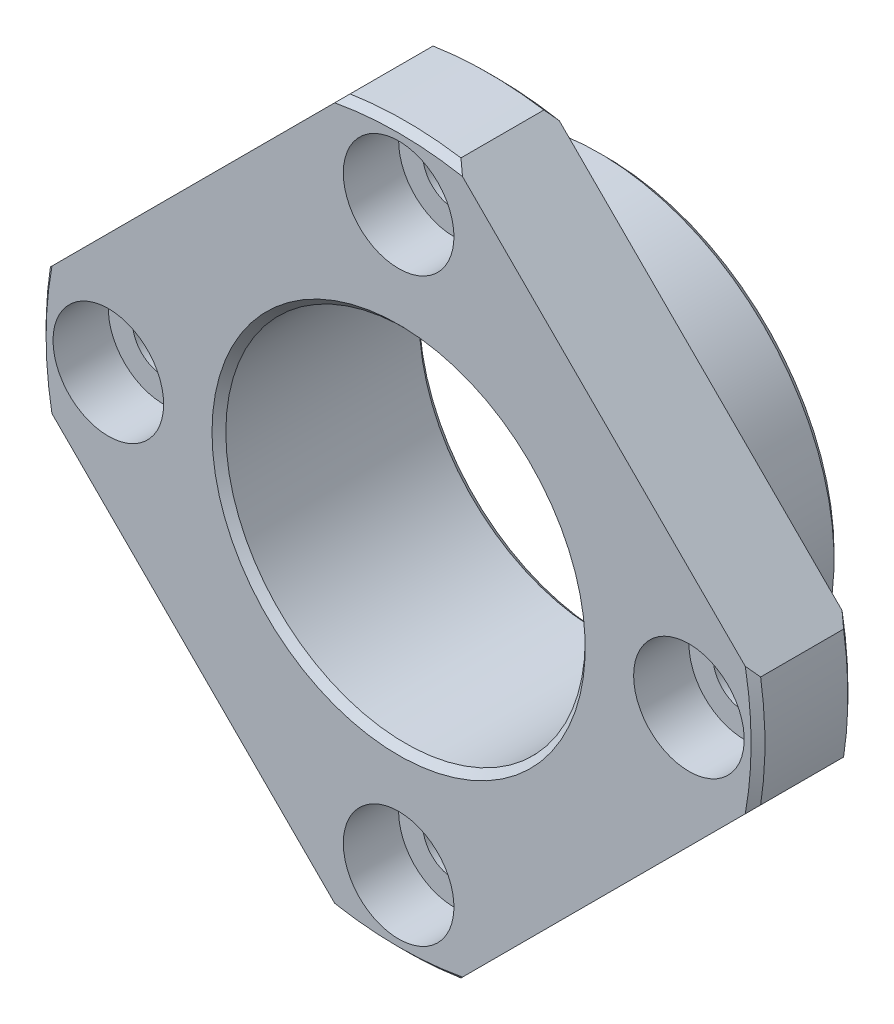
ISO-10303-21;
HEADER;
FILE_DESCRIPTION(('STEP AP214'),'2;1');
FILE_NAME('part.step','',(''),(''),'','','');
FILE_SCHEMA(('AUTOMOTIVE_DESIGN { 1 0 10303 214 1 1 1 1 }'));
ENDSEC;
DATA;
#1=APPLICATION_CONTEXT('core data for automotive mechanical design processes');
#2=APPLICATION_PROTOCOL_DEFINITION('international standard','automotive_design',2000,#1);
#3=PRODUCT_CONTEXT('',#1,'mechanical');
#4=PRODUCT('Part','Part','',(#3));
#5=PRODUCT_RELATED_PRODUCT_CATEGORY('part','',(#4));
#6=PRODUCT_DEFINITION_FORMATION('','',#4);
#7=PRODUCT_DEFINITION_CONTEXT('part definition',#1,'design');
#8=PRODUCT_DEFINITION('design','',#6,#7);
#9=PRODUCT_DEFINITION_SHAPE('','',#8);
#10=(LENGTH_UNIT() NAMED_UNIT(*) SI_UNIT(.MILLI.,.METRE.));
#11=(NAMED_UNIT(*) PLANE_ANGLE_UNIT() SI_UNIT($,.RADIAN.));
#12=(NAMED_UNIT(*) SI_UNIT($,.STERADIAN.) SOLID_ANGLE_UNIT());
#13=UNCERTAINTY_MEASURE_WITH_UNIT(LENGTH_MEASURE(1.E-05),#10,'distance_accuracy_value','');
#14=(GEOMETRIC_REPRESENTATION_CONTEXT(3) GLOBAL_UNCERTAINTY_ASSIGNED_CONTEXT((#13)) GLOBAL_UNIT_ASSIGNED_CONTEXT((#10,
#11,#12)) REPRESENTATION_CONTEXT('',''));
#15=CARTESIAN_POINT('',(0.,0.,0.));
#16=DIRECTION('',(0.,0.,1.));
#17=DIRECTION('',(1.,0.,0.));
#18=AXIS2_PLACEMENT_3D('',#15,#16,#17);
#19=CARTESIAN_POINT('',(0.,0.,14.5));
#20=DIRECTION('',(0.,0.,-1.));
#21=DIRECTION('',(-1.,0.,0.));
#22=AXIS2_PLACEMENT_3D('',#19,#20,#21);
#23=CONICAL_SURFACE('',#22,26.,0.785398163397448);
#24=CARTESIAN_POINT('',(-4.00949831199713,-25.6889864978378,14.499998));
#25=CARTESIAN_POINT('',(-4.11085711290763,-25.5876276969273,14.5845368428989));
#26=CARTESIAN_POINT('',(-4.21246236410353,-25.4860224457315,14.6684732573738));
#27=CARTESIAN_POINT('',(-4.41616580166347,-25.2823190081715,14.8351412577831));
#28=CARTESIAN_POINT('',(-4.51826398819497,-25.18022082164,14.9178728433081));
#29=CARTESIAN_POINT('',(-4.62060862517927,-25.0778761846558,15.000002));
#30=B_SPLINE_CURVE_WITH_KNOTS('',3,(#24,#25,#26,#27,#28,#29),.UNSPECIFIED.,.F.,.F.,(4,2,4),(0.,
0.499232593431779,0.998465356444911),.UNSPECIFIED.);
#31=CARTESIAN_POINT('',(-4.0095007105781,-25.6889840992569,14.5));
#32=VERTEX_POINT('',#31);
#33=CARTESIAN_POINT('',(-4.62060613217811,-25.0778786776569,15.));
#34=VERTEX_POINT('',#33);
#35=EDGE_CURVE('E301',#32,#34,#30,.T.);
#36=ORIENTED_EDGE('',*,*,#35,.F.);
#37=CARTESIAN_POINT('',(0.,0.,14.5));
#38=DIRECTION('',(0.,0.,-1.));
#39=DIRECTION('',(-1.,0.,0.));
#40=AXIS2_PLACEMENT_3D('',#37,#38,#39);
#41=CIRCLE('',#40,26.);
#42=CARTESIAN_POINT('',(4.0095007105781,-25.6889840992569,14.5));
#43=VERTEX_POINT('',#42);
#44=EDGE_CURVE('E599',#43,#32,#41,.T.);
#45=ORIENTED_EDGE('',*,*,#44,.F.);
#46=CARTESIAN_POINT('',(4.62060862517928,-25.0778761846558,15.000002));
#47=CARTESIAN_POINT('',(4.51826398819498,-25.18022082164,14.9178728433081));
#48=CARTESIAN_POINT('',(4.4161658016635,-25.2823190081715,14.8351412577831));
#49=CARTESIAN_POINT('',(4.21246236410355,-25.4860224457315,14.6684732573738));
#50=CARTESIAN_POINT('',(4.11085711290765,-25.5876276969273,14.5845368428989));
#51=CARTESIAN_POINT('',(4.00949831199714,-25.6889864978378,14.499998));
#52=B_SPLINE_CURVE_WITH_KNOTS('',3,(#46,#47,#48,#49,#50,#51),.UNSPECIFIED.,.F.,.F.,(4,2,4),(0.,
0.499232763013133,0.99846535644491),.UNSPECIFIED.);
#53=CARTESIAN_POINT('',(4.62060613217812,-25.0778786776569,15.));
#54=VERTEX_POINT('',#53);
#55=EDGE_CURVE('E352',#54,#43,#52,.T.);
#56=ORIENTED_EDGE('',*,*,#55,.F.);
#57=CARTESIAN_POINT('',(0.,0.,15.));
#58=DIRECTION('',(0.,0.,-1.));
#59=DIRECTION('',(-1.,0.,0.));
#60=AXIS2_PLACEMENT_3D('',#57,#58,#59);
#61=CIRCLE('',#60,25.5);
#62=EDGE_CURVE('E600',#54,#34,#61,.T.);
#63=ORIENTED_EDGE('',*,*,#62,.T.);
#64=EDGE_LOOP('',(#36,#45,#56,#63));
#65=FACE_BOUND('',#64,.T.);
#66=ADVANCED_FACE('F16',(#65),#23,.T.);
#67=CARTESIAN_POINT('',(0.,0.,0.));
#68=DIRECTION('',(0.,0.,-1.));
#69=DIRECTION('',(-1.,0.,0.));
#70=AXIS2_PLACEMENT_3D('',#67,#68,#69);
#71=CYLINDRICAL_SURFACE('',#70,26.);
#72=DIRECTION('',(0.,0.,-1.));
#73=VECTOR('',#72,1.);
#74=CARTESIAN_POINT('',(-4.0095007105781,-25.6889840992569,0.));
#75=LINE('',#74,#73);
#76=CARTESIAN_POINT('',(-4.0095007105781,-25.6889840992569,8.5));
#77=VERTEX_POINT('',#76);
#78=EDGE_CURVE('E302',#77,#32,#75,.F.);
#79=ORIENTED_EDGE('',*,*,#78,.F.);
#80=CARTESIAN_POINT('',(0.,0.,8.5));
#81=DIRECTION('',(0.,0.,-1.));
#82=DIRECTION('',(-1.,0.,0.));
#83=AXIS2_PLACEMENT_3D('',#80,#81,#82);
#84=CIRCLE('',#83,26.);
#85=CARTESIAN_POINT('',(4.00950071057811,-25.6889840992569,8.5));
#86=VERTEX_POINT('',#85);
#87=EDGE_CURVE('E141',#86,#77,#84,.T.);
#88=ORIENTED_EDGE('',*,*,#87,.F.);
#89=DIRECTION('',(0.,0.,-1.));
#90=VECTOR('',#89,1.);
#91=CARTESIAN_POINT('',(4.00950071057811,-25.6889840992569,0.));
#92=LINE('',#91,#90);
#93=EDGE_CURVE('E570',#43,#86,#92,.T.);
#94=ORIENTED_EDGE('',*,*,#93,.F.);
#95=ORIENTED_EDGE('',*,*,#44,.T.);
#96=EDGE_LOOP('',(#79,#88,#94,#95));
#97=FACE_BOUND('',#96,.T.);
#98=ADVANCED_FACE('F487',(#97),#71,.T.);
#99=CARTESIAN_POINT('',(0.,0.,8.));
#100=DIRECTION('',(0.,0.,1.));
#101=DIRECTION('',(1.,0.,0.));
#102=AXIS2_PLACEMENT_3D('',#99,#100,#101);
#103=CONICAL_SURFACE('',#102,25.5,0.785398163397446);
#104=CARTESIAN_POINT('',(-4.62060862517927,-25.0778761846558,7.999998));
#105=CARTESIAN_POINT('',(-4.51826398819497,-25.18022082164,8.08212715669186));
#106=CARTESIAN_POINT('',(-4.41616580166347,-25.2823190081715,8.16485874221692));
#107=CARTESIAN_POINT('',(-4.21246236410352,-25.4860224457315,8.33152674262619));
#108=CARTESIAN_POINT('',(-4.11085711290763,-25.5876276969273,8.41546315710113));
#109=CARTESIAN_POINT('',(-4.00949831199713,-25.6889864978378,8.500002));
#110=B_SPLINE_CURVE_WITH_KNOTS('',3,(#104,#105,#106,#107,#108,#109),.UNSPECIFIED.,.F.,.F.,(4,2,
4),(0.,0.499232763013133,0.998465356444911),.UNSPECIFIED.);
#111=CARTESIAN_POINT('',(-4.62060613217811,-25.0778786776569,8.));
#112=VERTEX_POINT('',#111);
#113=EDGE_CURVE('E130',#112,#77,#110,.T.);
#114=ORIENTED_EDGE('',*,*,#113,.F.);
#115=CARTESIAN_POINT('',(0.,0.,8.));
#116=DIRECTION('',(0.,0.,-1.));
#117=DIRECTION('',(-1.,0.,0.));
#118=AXIS2_PLACEMENT_3D('',#115,#116,#117);
#119=CIRCLE('',#118,25.5);
#120=CARTESIAN_POINT('',(4.62060613217811,-25.0778786776569,8.));
#121=VERTEX_POINT('',#120);
#122=EDGE_CURVE('E139',#121,#112,#119,.T.);
#123=ORIENTED_EDGE('',*,*,#122,.F.);
#124=CARTESIAN_POINT('',(4.00949831199714,-25.6889864978378,8.500002));
#125=CARTESIAN_POINT('',(4.11085711290766,-25.5876276969273,8.41546315710114));
#126=CARTESIAN_POINT('',(4.21246236410355,-25.4860224457315,8.3315267426262));
#127=CARTESIAN_POINT('',(4.4161658016635,-25.2823190081715,8.16485874221693));
#128=CARTESIAN_POINT('',(4.51826398819498,-25.18022082164,8.08212715669187));
#129=CARTESIAN_POINT('',(4.62060862517928,-25.0778761846558,7.999998));
#130=B_SPLINE_CURVE_WITH_KNOTS('',3,(#124,#125,#126,#127,#128,#129),.UNSPECIFIED.,.F.,.F.,(4,2,
4),(0.,0.499232593431776,0.998465356444908),.UNSPECIFIED.);
#131=EDGE_CURVE('E41',#86,#121,#130,.T.);
#132=ORIENTED_EDGE('',*,*,#131,.F.);
#133=ORIENTED_EDGE('',*,*,#87,.T.);
#134=EDGE_LOOP('',(#114,#123,#132,#133));
#135=FACE_BOUND('',#134,.T.);
#136=ADVANCED_FACE('F138',(#135),#103,.T.);
#137=CARTESIAN_POINT('',(25.6889864978378,-4.00949831199713,14.499998));
#138=CARTESIAN_POINT('',(25.5876276969273,-4.11085711290764,14.5845368428989));
#139=CARTESIAN_POINT('',(25.4860224457315,-4.21246236410352,14.6684732573738));
#140=CARTESIAN_POINT('',(25.2823190081715,-4.41616580166347,14.8351412577831));
#141=CARTESIAN_POINT('',(25.18022082164,-4.51826398819496,14.9178728433081));
#142=CARTESIAN_POINT('',(25.0778761846558,-4.62060862517926,15.000002));
#143=B_SPLINE_CURVE_WITH_KNOTS('',3,(#137,#138,#139,#140,#141,#142),.UNSPECIFIED.,.F.,.F.,(4,2,
4),(0.,0.499232593431774,0.998465356444904),.UNSPECIFIED.);
#144=CARTESIAN_POINT('',(25.6889840992569,-4.0095007105781,14.5));
#145=VERTEX_POINT('',#144);
#146=CARTESIAN_POINT('',(25.0778786776569,-4.6206061321781,15.));
#147=VERTEX_POINT('',#146);
#148=EDGE_CURVE('E359',#145,#147,#143,.T.);
#149=ORIENTED_EDGE('',*,*,#148,.F.);
#150=CARTESIAN_POINT('',(25.6889840992569,4.0095007105781,14.5));
#151=VERTEX_POINT('',#150);
#152=EDGE_CURVE('E176',#151,#145,#41,.T.);
#153=ORIENTED_EDGE('',*,*,#152,.F.);
#154=CARTESIAN_POINT('',(25.0778761846558,4.62060862517927,15.000002));
#155=CARTESIAN_POINT('',(25.18022082164,4.51826398819497,14.9178728433081));
#156=CARTESIAN_POINT('',(25.2823190081715,4.41616580166349,14.8351412577831));
#157=CARTESIAN_POINT('',(25.4860224457315,4.21246236410354,14.6684732573738));
#158=CARTESIAN_POINT('',(25.5876276969273,4.11085711290765,14.5845368428989));
#159=CARTESIAN_POINT('',(25.6889864978378,4.00949831199713,14.499998));
#160=B_SPLINE_CURVE_WITH_KNOTS('',3,(#154,#155,#156,#157,#158,#159),.UNSPECIFIED.,.F.,.F.,(4,2,
4),(0.,0.499232763013131,0.998465356444908),.UNSPECIFIED.);
#161=CARTESIAN_POINT('',(25.0778786776569,4.62060613217811,15.));
#162=VERTEX_POINT('',#161);
#163=EDGE_CURVE('E336',#162,#151,#160,.T.);
#164=ORIENTED_EDGE('',*,*,#163,.F.);
#165=EDGE_CURVE('E182',#162,#147,#61,.T.);
#166=ORIENTED_EDGE('',*,*,#165,.T.);
#167=EDGE_LOOP('',(#149,#153,#164,#166));
#168=FACE_BOUND('',#167,.T.);
#169=ADVANCED_FACE('F489',(#168),#23,.T.);
#170=DIRECTION('',(0.,0.,-1.));
#171=VECTOR('',#170,1.);
#172=CARTESIAN_POINT('',(25.6889840992569,-4.0095007105781,0.));
#173=LINE('',#172,#171);
#174=CARTESIAN_POINT('',(25.6889840992569,-4.0095007105781,8.5));
#175=VERTEX_POINT('',#174);
#176=EDGE_CURVE('E569',#175,#145,#173,.F.);
#177=ORIENTED_EDGE('',*,*,#176,.F.);
#178=CARTESIAN_POINT('',(25.6889840992569,4.0095007105781,8.5));
#179=VERTEX_POINT('',#178);
#180=EDGE_CURVE('E170',#179,#175,#84,.T.);
#181=ORIENTED_EDGE('',*,*,#180,.F.);
#182=DIRECTION('',(0.,0.,-1.));
#183=VECTOR('',#182,1.);
#184=CARTESIAN_POINT('',(25.6889840992569,4.0095007105781,0.));
#185=LINE('',#184,#183);
#186=EDGE_CURVE('E542',#151,#179,#185,.T.);
#187=ORIENTED_EDGE('',*,*,#186,.F.);
#188=ORIENTED_EDGE('',*,*,#152,.T.);
#189=EDGE_LOOP('',(#177,#181,#187,#188));
#190=FACE_BOUND('',#189,.T.);
#191=ADVANCED_FACE('F494',(#190),#71,.T.);
#192=CARTESIAN_POINT('',(25.0778761846558,-4.62060862517927,7.999998));
#193=CARTESIAN_POINT('',(25.18022082164,-4.51826398819497,8.08212715669187));
#194=CARTESIAN_POINT('',(25.2823190081715,-4.41616580166348,8.16485874221693));
#195=CARTESIAN_POINT('',(25.4860224457315,-4.21246236410353,8.3315267426262));
#196=CARTESIAN_POINT('',(25.5876276969273,-4.11085711290764,8.41546315710114));
#197=CARTESIAN_POINT('',(25.6889864978378,-4.00949831199713,8.500002));
#198=B_SPLINE_CURVE_WITH_KNOTS('',3,(#192,#193,#194,#195,#196,#197),.UNSPECIFIED.,.F.,.F.,(4,2,
4),(0.,0.499232763013132,0.998465356444908),.UNSPECIFIED.);
#199=CARTESIAN_POINT('',(25.0778786776569,-4.6206061321781,8.));
#200=VERTEX_POINT('',#199);
#201=EDGE_CURVE('E567',#200,#175,#198,.T.);
#202=ORIENTED_EDGE('',*,*,#201,.F.);
#203=CARTESIAN_POINT('',(25.0778786776569,4.62060613217811,8.));
#204=VERTEX_POINT('',#203);
#205=EDGE_CURVE('E149',#204,#200,#119,.T.);
#206=ORIENTED_EDGE('',*,*,#205,.F.);
#207=CARTESIAN_POINT('',(25.6889864978378,4.00949831199714,8.500002));
#208=CARTESIAN_POINT('',(25.5876276969273,4.11085711290765,8.41546315710114));
#209=CARTESIAN_POINT('',(25.4860224457315,4.21246236410354,8.3315267426262));
#210=CARTESIAN_POINT('',(25.2823190081715,4.41616580166349,8.16485874221693));
#211=CARTESIAN_POINT('',(25.18022082164,4.51826398819497,8.08212715669187));
#212=CARTESIAN_POINT('',(25.0778761846558,4.62060862517927,7.999998));
#213=B_SPLINE_CURVE_WITH_KNOTS('',3,(#207,#208,#209,#210,#211,#212),.UNSPECIFIED.,.F.,.F.,(4,2,
4),(0.,0.499232593431774,0.998465356444902),.UNSPECIFIED.);
#214=EDGE_CURVE('E370',#179,#204,#213,.T.);
#215=ORIENTED_EDGE('',*,*,#214,.F.);
#216=ORIENTED_EDGE('',*,*,#180,.T.);
#217=EDGE_LOOP('',(#202,#206,#215,#216));
#218=FACE_BOUND('',#217,.T.);
#219=ADVANCED_FACE('F502',(#218),#103,.T.);
#220=CARTESIAN_POINT('',(4.00949831199713,25.6889864978378,14.499998));
#221=CARTESIAN_POINT('',(4.11085711290764,25.5876276969273,14.5845368428989));
#222=CARTESIAN_POINT('',(4.21246236410353,25.4860224457315,14.6684732573738));
#223=CARTESIAN_POINT('',(4.41616580166348,25.2823190081715,14.8351412577831));
#224=CARTESIAN_POINT('',(4.51826398819497,25.18022082164,14.9178728433081));
#225=CARTESIAN_POINT('',(4.62060862517927,25.0778761846558,15.000002));
#226=B_SPLINE_CURVE_WITH_KNOTS('',3,(#220,#221,#222,#223,#224,#225),.UNSPECIFIED.,.F.,.F.,(4,2,
4),(0.,0.499232593431777,0.998465356444911),.UNSPECIFIED.);
#227=CARTESIAN_POINT('',(4.0095007105781,25.6889840992569,14.5));
#228=VERTEX_POINT('',#227);
#229=CARTESIAN_POINT('',(4.62060613217811,25.0778786776569,15.));
#230=VERTEX_POINT('',#229);
#231=EDGE_CURVE('E344',#228,#230,#226,.T.);
#232=ORIENTED_EDGE('',*,*,#231,.F.);
#233=CARTESIAN_POINT('',(-4.00950071057811,25.6889840992569,14.5));
#234=VERTEX_POINT('',#233);
#235=EDGE_CURVE('E171',#234,#228,#41,.T.);
#236=ORIENTED_EDGE('',*,*,#235,.F.);
#237=CARTESIAN_POINT('',(-4.62060862517927,25.0778761846558,15.000002));
#238=CARTESIAN_POINT('',(-4.51826398819497,25.18022082164,14.9178728433081));
#239=CARTESIAN_POINT('',(-4.41616580166349,25.2823190081715,14.8351412577831));
#240=CARTESIAN_POINT('',(-4.21246236410354,25.4860224457315,14.6684732573738));
#241=CARTESIAN_POINT('',(-4.11085711290765,25.5876276969273,14.5845368428989));
#242=CARTESIAN_POINT('',(-4.00949831199714,25.6889864978378,14.499998));
#243=B_SPLINE_CURVE_WITH_KNOTS('',3,(#237,#238,#239,#240,#241,#242),.UNSPECIFIED.,.F.,.F.,(4,2,
4),(0.,0.49923276301313,0.998465356444904),.UNSPECIFIED.);
#244=CARTESIAN_POINT('',(-4.62060613217811,25.0778786776569,15.));
#245=VERTEX_POINT('',#244);
#246=EDGE_CURVE('E318',#245,#234,#243,.T.);
#247=ORIENTED_EDGE('',*,*,#246,.F.);
#248=EDGE_CURVE('E177',#245,#230,#61,.T.);
#249=ORIENTED_EDGE('',*,*,#248,.T.);
#250=EDGE_LOOP('',(#232,#236,#247,#249));
#251=FACE_BOUND('',#250,.T.);
#252=ADVANCED_FACE('F314',(#251),#23,.T.);
#253=DIRECTION('',(0.,0.,-1.));
#254=VECTOR('',#253,1.);
#255=CARTESIAN_POINT('',(4.0095007105781,25.6889840992569,0.));
#256=LINE('',#255,#254);
#257=CARTESIAN_POINT('',(4.0095007105781,25.6889840992569,8.5));
#258=VERTEX_POINT('',#257);
#259=EDGE_CURVE('E521',#258,#228,#256,.F.);
#260=ORIENTED_EDGE('',*,*,#259,.F.);
#261=CARTESIAN_POINT('',(-4.00950071057811,25.6889840992569,8.5));
#262=VERTEX_POINT('',#261);
#263=EDGE_CURVE('E165',#262,#258,#84,.T.);
#264=ORIENTED_EDGE('',*,*,#263,.F.);
#265=DIRECTION('',(0.,0.,-1.));
#266=VECTOR('',#265,1.);
#267=CARTESIAN_POINT('',(-4.0095007105781,25.6889840992569,0.));
#268=LINE('',#267,#266);
#269=EDGE_CURVE('E415',#234,#262,#268,.T.);
#270=ORIENTED_EDGE('',*,*,#269,.F.);
#271=ORIENTED_EDGE('',*,*,#235,.T.);
#272=EDGE_LOOP('',(#260,#264,#270,#271));
#273=FACE_BOUND('',#272,.T.);
#274=ADVANCED_FACE('F504',(#273),#71,.T.);
#275=CARTESIAN_POINT('',(4.62060862517927,25.0778761846558,7.999998));
#276=CARTESIAN_POINT('',(4.51826398819497,25.18022082164,8.08212715669187));
#277=CARTESIAN_POINT('',(4.41616580166348,25.2823190081715,8.16485874221692));
#278=CARTESIAN_POINT('',(4.21246236410354,25.4860224457315,8.3315267426262));
#279=CARTESIAN_POINT('',(4.11085711290764,25.5876276969273,8.41546315710114));
#280=CARTESIAN_POINT('',(4.00949831199713,25.6889864978378,8.500002));
#281=B_SPLINE_CURVE_WITH_KNOTS('',3,(#275,#276,#277,#278,#279,#280),.UNSPECIFIED.,.F.,.F.,(4,2,
4),(0.,0.499232763013133,0.998465356444908),.UNSPECIFIED.);
#282=CARTESIAN_POINT('',(4.6206061321781,25.0778786776569,8.));
#283=VERTEX_POINT('',#282);
#284=EDGE_CURVE('E377',#283,#258,#281,.T.);
#285=ORIENTED_EDGE('',*,*,#284,.F.);
#286=CARTESIAN_POINT('',(-4.62060613217811,25.0778786776569,8.));
#287=VERTEX_POINT('',#286);
#288=EDGE_CURVE('E156',#287,#283,#119,.T.);
#289=ORIENTED_EDGE('',*,*,#288,.F.);
#290=CARTESIAN_POINT('',(-4.00949831199714,25.6889864978378,8.500002));
#291=CARTESIAN_POINT('',(-4.11085711290765,25.5876276969273,8.41546315710114));
#292=CARTESIAN_POINT('',(-4.21246236410354,25.4860224457315,8.3315267426262));
#293=CARTESIAN_POINT('',(-4.41616580166348,25.2823190081715,8.16485874221692));
#294=CARTESIAN_POINT('',(-4.51826398819497,25.18022082164,8.08212715669187));
#295=CARTESIAN_POINT('',(-4.62060862517927,25.0778761846558,7.999998));
#296=B_SPLINE_CURVE_WITH_KNOTS('',3,(#290,#291,#292,#293,#294,#295),.UNSPECIFIED.,.F.,.F.,(4,2,
4),(0.,0.499232593431774,0.998465356444904),.UNSPECIFIED.);
#297=EDGE_CURVE('E400',#262,#287,#296,.T.);
#298=ORIENTED_EDGE('',*,*,#297,.F.);
#299=ORIENTED_EDGE('',*,*,#263,.T.);
#300=EDGE_LOOP('',(#285,#289,#298,#299));
#301=FACE_BOUND('',#300,.T.);
#302=ADVANCED_FACE('F484',(#301),#103,.T.);
#303=CARTESIAN_POINT('',(0.,0.,14.5));
#304=DIRECTION('',(0.,0.,1.));
#305=DIRECTION('',(1.,0.,0.));
#306=AXIS2_PLACEMENT_3D('',#303,#304,#305);
#307=CONICAL_SURFACE('',#306,13.,0.78539816339745);
#308=CARTESIAN_POINT('',(0.,0.,15.));
#309=DIRECTION('',(0.,0.,-1.));
#310=DIRECTION('',(-1.,0.,0.));
#311=AXIS2_PLACEMENT_3D('',#308,#309,#310);
#312=CIRCLE('',#311,13.5);
#313=CARTESIAN_POINT('',(-13.5,0.,15.));
#314=VERTEX_POINT('',#313);
#315=EDGE_CURVE('E181',#314,#314,#312,.T.);
#316=ORIENTED_EDGE('',*,*,#315,.F.);
#317=EDGE_LOOP('',(#316));
#318=FACE_BOUND('',#317,.T.);
#319=CARTESIAN_POINT('',(0.,0.,14.5));
#320=DIRECTION('',(0.,0.,-1.));
#321=DIRECTION('',(-1.,0.,0.));
#322=AXIS2_PLACEMENT_3D('',#319,#320,#321);
#323=CIRCLE('',#322,13.);
#324=CARTESIAN_POINT('',(-13.,0.,14.5));
#325=VERTEX_POINT('',#324);
#326=EDGE_CURVE('E436',#325,#325,#323,.T.);
#327=ORIENTED_EDGE('',*,*,#326,.T.);
#328=EDGE_LOOP('',(#327));
#329=FACE_BOUND('',#328,.T.);
#330=ADVANCED_FACE('F18',(#318,#329),#307,.F.);
#331=CARTESIAN_POINT('',(0.,13.5,15.));
#332=DIRECTION('',(0.,0.,-1.));
#333=DIRECTION('',(-1.,0.,0.));
#334=AXIS2_PLACEMENT_3D('',#331,#332,#333);
#335=PLANE('',#334);
#336=CARTESIAN_POINT('',(21.,0.,15.));
#337=DIRECTION('',(0.,0.,-1.));
#338=DIRECTION('',(-1.,0.,0.));
#339=AXIS2_PLACEMENT_3D('',#336,#337,#338);
#340=CIRCLE('',#339,4.);
#341=CARTESIAN_POINT('',(17.,0.,15.));
#342=VERTEX_POINT('',#341);
#343=EDGE_CURVE('E20',#342,#342,#340,.T.);
#344=ORIENTED_EDGE('',*,*,#343,.T.);
#345=EDGE_LOOP('',(#344));
#346=FACE_BOUND('',#345,.T.);
#347=CARTESIAN_POINT('',(0.,21.,15.));
#348=DIRECTION('',(0.,0.,-1.));
#349=DIRECTION('',(-1.,0.,0.));
#350=AXIS2_PLACEMENT_3D('',#347,#348,#349);
#351=CIRCLE('',#350,4.);
#352=CARTESIAN_POINT('',(-4.,21.,15.));
#353=VERTEX_POINT('',#352);
#354=EDGE_CURVE('E218',#353,#353,#351,.T.);
#355=ORIENTED_EDGE('',*,*,#354,.T.);
#356=EDGE_LOOP('',(#355));
#357=FACE_BOUND('',#356,.T.);
#358=CARTESIAN_POINT('',(-21.,0.,15.));
#359=DIRECTION('',(0.,0.,-1.));
#360=DIRECTION('',(-1.,0.,0.));
#361=AXIS2_PLACEMENT_3D('',#358,#359,#360);
#362=CIRCLE('',#361,4.);
#363=CARTESIAN_POINT('',(-25.,0.,15.));
#364=VERTEX_POINT('',#363);
#365=EDGE_CURVE('E208',#364,#364,#362,.T.);
#366=ORIENTED_EDGE('',*,*,#365,.T.);
#367=EDGE_LOOP('',(#366));
#368=FACE_BOUND('',#367,.T.);
#369=CARTESIAN_POINT('',(0.,-21.,15.));
#370=DIRECTION('',(0.,0.,-1.));
#371=DIRECTION('',(-1.,0.,0.));
#372=AXIS2_PLACEMENT_3D('',#369,#370,#371);
#373=CIRCLE('',#372,4.);
#374=CARTESIAN_POINT('',(-4.,-21.,15.));
#375=VERTEX_POINT('',#374);
#376=EDGE_CURVE('E199',#375,#375,#373,.T.);
#377=ORIENTED_EDGE('',*,*,#376,.T.);
#378=EDGE_LOOP('',(#377));
#379=FACE_BOUND('',#378,.T.);
#380=CARTESIAN_POINT('',(-25.0778786776569,-4.62060613217812,15.));
#381=VERTEX_POINT('',#380);
#382=CARTESIAN_POINT('',(-25.0778786776569,4.62060613217811,15.));
#383=VERTEX_POINT('',#382);
#384=EDGE_CURVE('E175',#381,#383,#61,.T.);
#385=ORIENTED_EDGE('',*,*,#384,.F.);
#386=DIRECTION('',(0.707106781186548,-0.707106781186547,0.));
#387=VECTOR('',#386,1.);
#388=CARTESIAN_POINT('',(-21.5992424049175,-8.09924240491751,15.));
#389=LINE('',#388,#387);
#390=EDGE_CURVE('E584',#381,#34,#389,.T.);
#391=ORIENTED_EDGE('',*,*,#390,.T.);
#392=ORIENTED_EDGE('',*,*,#62,.F.);
#393=DIRECTION('',(0.707106781186547,0.707106781186548,0.));
#394=VECTOR('',#393,1.);
#395=CARTESIAN_POINT('',(21.5992424049175,-8.09924240491749,15.));
#396=LINE('',#395,#394);
#397=EDGE_CURVE('E366',#54,#147,#396,.T.);
#398=ORIENTED_EDGE('',*,*,#397,.T.);
#399=ORIENTED_EDGE('',*,*,#165,.F.);
#400=DIRECTION('',(-0.707106781186548,0.707106781186548,0.));
#401=VECTOR('',#400,1.);
#402=CARTESIAN_POINT('',(8.0992424049175,21.5992424049175,15.));
#403=LINE('',#402,#401);
#404=EDGE_CURVE('E518',#162,#230,#403,.T.);
#405=ORIENTED_EDGE('',*,*,#404,.T.);
#406=ORIENTED_EDGE('',*,*,#248,.F.);
#407=DIRECTION('',(-0.707106781186548,-0.707106781186548,0.));
#408=VECTOR('',#407,1.);
#409=CARTESIAN_POINT('',(-8.0992424049175,21.5992424049175,15.));
#410=LINE('',#409,#408);
#411=EDGE_CURVE('E431',#245,#383,#410,.T.);
#412=ORIENTED_EDGE('',*,*,#411,.T.);
#413=EDGE_LOOP('',(#385,#391,#392,#398,#399,#405,#406,#412));
#414=FACE_BOUND('',#413,.T.);
#415=ORIENTED_EDGE('',*,*,#315,.T.);
#416=EDGE_LOOP('',(#415));
#417=FACE_BOUND('',#416,.T.);
#418=ADVANCED_FACE('F312',(#346,#357,#368,#379,#414,#417),#335,.F.);
#419=CARTESIAN_POINT('',(-25.0778761846558,-4.62060862517928,15.000002));
#420=CARTESIAN_POINT('',(-25.18022082164,-4.51826398819498,14.9178728433081));
#421=CARTESIAN_POINT('',(-25.2823190081715,-4.4161658016635,14.8351412577831));
#422=CARTESIAN_POINT('',(-25.4860224457315,-4.21246236410355,14.6684732573738));
#423=CARTESIAN_POINT('',(-25.5876276969273,-4.11085711290766,14.5845368428989));
#424=CARTESIAN_POINT('',(-25.6889864978378,-4.00949831199715,14.499998));
#425=B_SPLINE_CURVE_WITH_KNOTS('',3,(#419,#420,#421,#422,#423,#424),.UNSPECIFIED.,.F.,.F.,(4,2,
4),(0.,0.499232763013129,0.998465356444904),.UNSPECIFIED.);
#426=CARTESIAN_POINT('',(-25.6889840992569,-4.00950071057811,14.5));
#427=VERTEX_POINT('',#426);
#428=EDGE_CURVE('E293',#381,#427,#425,.T.);
#429=ORIENTED_EDGE('',*,*,#428,.F.);
#430=ORIENTED_EDGE('',*,*,#384,.T.);
#431=CARTESIAN_POINT('',(-25.6889864978378,4.00949831199713,14.499998));
#432=CARTESIAN_POINT('',(-25.5876276969273,4.11085711290765,14.5845368428989));
#433=CARTESIAN_POINT('',(-25.4860224457315,4.21246236410354,14.6684732573738));
#434=CARTESIAN_POINT('',(-25.2823190081715,4.41616580166349,14.8351412577831));
#435=CARTESIAN_POINT('',(-25.18022082164,4.51826398819497,14.9178728433081));
#436=CARTESIAN_POINT('',(-25.0778761846558,4.62060862517927,15.000002));
#437=B_SPLINE_CURVE_WITH_KNOTS('',3,(#431,#432,#433,#434,#435,#436),.UNSPECIFIED.,.F.,.F.,(4,2,
4),(0.,0.499232593431776,0.998465356444908),.UNSPECIFIED.);
#438=CARTESIAN_POINT('',(-25.6889840992569,4.0095007105781,14.5));
#439=VERTEX_POINT('',#438);
#440=EDGE_CURVE('E328',#439,#383,#437,.T.);
#441=ORIENTED_EDGE('',*,*,#440,.F.);
#442=EDGE_CURVE('E169',#427,#439,#41,.T.);
#443=ORIENTED_EDGE('',*,*,#442,.F.);
#444=EDGE_LOOP('',(#429,#430,#441,#443));
#445=FACE_BOUND('',#444,.T.);
#446=ADVANCED_FACE('F308',(#445),#23,.T.);
#447=DIRECTION('',(0.,0.,-1.));
#448=VECTOR('',#447,1.);
#449=CARTESIAN_POINT('',(-25.6889840992569,-4.00950071057811,0.));
#450=LINE('',#449,#448);
#451=CARTESIAN_POINT('',(-25.6889840992569,-4.00950071057811,8.5));
#452=VERTEX_POINT('',#451);
#453=EDGE_CURVE('E143',#427,#452,#450,.T.);
#454=ORIENTED_EDGE('',*,*,#453,.F.);
#455=ORIENTED_EDGE('',*,*,#442,.T.);
#456=DIRECTION('',(0.,0.,-1.));
#457=VECTOR('',#456,1.);
#458=CARTESIAN_POINT('',(-25.6889840992569,4.0095007105781,0.));
#459=LINE('',#458,#457);
#460=CARTESIAN_POINT('',(-25.6889840992569,4.0095007105781,8.5));
#461=VERTEX_POINT('',#460);
#462=EDGE_CURVE('E417',#461,#439,#459,.F.);
#463=ORIENTED_EDGE('',*,*,#462,.F.);
#464=EDGE_CURVE('E163',#452,#461,#84,.T.);
#465=ORIENTED_EDGE('',*,*,#464,.F.);
#466=EDGE_LOOP('',(#454,#455,#463,#465));
#467=FACE_BOUND('',#466,.T.);
#468=ADVANCED_FACE('F311',(#467),#71,.T.);
#469=CARTESIAN_POINT('',(-25.6889864978378,-4.00949831199714,8.500002));
#470=CARTESIAN_POINT('',(-25.5876276969273,-4.11085711290765,8.41546315710114));
#471=CARTESIAN_POINT('',(-25.4860224457315,-4.21246236410355,8.3315267426262));
#472=CARTESIAN_POINT('',(-25.2823190081715,-4.4161658016635,8.16485874221692));
#473=CARTESIAN_POINT('',(-25.18022082164,-4.51826398819498,8.08212715669187));
#474=CARTESIAN_POINT('',(-25.0778761846558,-4.62060862517928,7.999998));
#475=B_SPLINE_CURVE_WITH_KNOTS('',3,(#469,#470,#471,#472,#473,#474),.UNSPECIFIED.,.F.,.F.,(4,2,
4),(0.,0.499232593431778,0.998465356444911),.UNSPECIFIED.);
#476=CARTESIAN_POINT('',(-25.0778786776569,-4.62060613217812,8.));
#477=VERTEX_POINT('',#476);
#478=EDGE_CURVE('E33',#452,#477,#475,.T.);
#479=ORIENTED_EDGE('',*,*,#478,.F.);
#480=ORIENTED_EDGE('',*,*,#464,.T.);
#481=CARTESIAN_POINT('',(-25.0778761846558,4.62060862517927,7.999998));
#482=CARTESIAN_POINT('',(-25.18022082164,4.51826398819497,8.08212715669186));
#483=CARTESIAN_POINT('',(-25.2823190081715,4.41616580166348,8.16485874221692));
#484=CARTESIAN_POINT('',(-25.4860224457315,4.21246236410353,8.33152674262619));
#485=CARTESIAN_POINT('',(-25.5876276969273,4.11085711290764,8.41546315710114));
#486=CARTESIAN_POINT('',(-25.6889864978378,4.00949831199713,8.500002));
#487=B_SPLINE_CURVE_WITH_KNOTS('',3,(#481,#482,#483,#484,#485,#486),.UNSPECIFIED.,.F.,.F.,(4,2,
4),(0.,0.499232763013134,0.998465356444911),.UNSPECIFIED.);
#488=CARTESIAN_POINT('',(-25.0778786776569,4.6206061321781,8.));
#489=VERTEX_POINT('',#488);
#490=EDGE_CURVE('E407',#489,#461,#487,.T.);
#491=ORIENTED_EDGE('',*,*,#490,.F.);
#492=EDGE_CURVE('E150',#477,#489,#119,.T.);
#493=ORIENTED_EDGE('',*,*,#492,.F.);
#494=EDGE_LOOP('',(#479,#480,#491,#493));
#495=FACE_BOUND('',#494,.T.);
#496=ADVANCED_FACE('F274',(#495),#103,.T.);
#497=CARTESIAN_POINT('',(0.,17.5,8.));
#498=DIRECTION('',(0.,0.,-1.));
#499=DIRECTION('',(-1.,0.,0.));
#500=AXIS2_PLACEMENT_3D('',#497,#498,#499);
#501=PLANE('',#500);
#502=CARTESIAN_POINT('',(21.,0.,8.));
#503=DIRECTION('',(0.,0.,-1.));
#504=DIRECTION('',(-1.,0.,0.));
#505=AXIS2_PLACEMENT_3D('',#502,#503,#504);
#506=CIRCLE('',#505,2.25);
#507=CARTESIAN_POINT('',(18.75,0.,8.));
#508=VERTEX_POINT('',#507);
#509=EDGE_CURVE('E223',#508,#508,#506,.T.);
#510=ORIENTED_EDGE('',*,*,#509,.F.);
#511=EDGE_LOOP('',(#510));
#512=FACE_BOUND('',#511,.T.);
#513=CARTESIAN_POINT('',(0.,21.,8.));
#514=DIRECTION('',(0.,0.,-1.));
#515=DIRECTION('',(-1.,0.,0.));
#516=AXIS2_PLACEMENT_3D('',#513,#514,#515);
#517=CIRCLE('',#516,2.25);
#518=CARTESIAN_POINT('',(-2.25,21.,8.));
#519=VERTEX_POINT('',#518);
#520=EDGE_CURVE('E214',#519,#519,#517,.T.);
#521=ORIENTED_EDGE('',*,*,#520,.F.);
#522=EDGE_LOOP('',(#521));
#523=FACE_BOUND('',#522,.T.);
#524=CARTESIAN_POINT('',(-21.,0.,8.));
#525=DIRECTION('',(0.,0.,-1.));
#526=DIRECTION('',(-1.,0.,0.));
#527=AXIS2_PLACEMENT_3D('',#524,#525,#526);
#528=CIRCLE('',#527,2.25);
#529=CARTESIAN_POINT('',(-23.25,0.,8.));
#530=VERTEX_POINT('',#529);
#531=EDGE_CURVE('E204',#530,#530,#528,.T.);
#532=ORIENTED_EDGE('',*,*,#531,.F.);
#533=EDGE_LOOP('',(#532));
#534=FACE_BOUND('',#533,.T.);
#535=CARTESIAN_POINT('',(0.,-21.,8.));
#536=DIRECTION('',(0.,0.,-1.));
#537=DIRECTION('',(-1.,0.,0.));
#538=AXIS2_PLACEMENT_3D('',#535,#536,#537);
#539=CIRCLE('',#538,2.25);
#540=CARTESIAN_POINT('',(-2.25,-21.,8.));
#541=VERTEX_POINT('',#540);
#542=EDGE_CURVE('E195',#541,#541,#539,.T.);
#543=ORIENTED_EDGE('',*,*,#542,.F.);
#544=EDGE_LOOP('',(#543));
#545=FACE_BOUND('',#544,.T.);
#546=DIRECTION('',(0.707106781186548,-0.707106781186547,0.));
#547=VECTOR('',#546,1.);
#548=CARTESIAN_POINT('',(-23.5992424049175,-6.09924240491751,8.));
#549=LINE('',#548,#547);
#550=EDGE_CURVE('E11',#477,#112,#549,.T.);
#551=ORIENTED_EDGE('',*,*,#550,.F.);
#552=ORIENTED_EDGE('',*,*,#492,.T.);
#553=DIRECTION('',(-0.707106781186548,-0.707106781186548,0.));
#554=VECTOR('',#553,1.);
#555=CARTESIAN_POINT('',(-6.0992424049175,23.5992424049175,8.));
#556=LINE('',#555,#554);
#557=EDGE_CURVE('E186',#287,#489,#556,.T.);
#558=ORIENTED_EDGE('',*,*,#557,.F.);
#559=ORIENTED_EDGE('',*,*,#288,.T.);
#560=DIRECTION('',(-0.707106781186548,0.707106781186548,0.));
#561=VECTOR('',#560,1.);
#562=CARTESIAN_POINT('',(6.0992424049175,23.5992424049175,8.));
#563=LINE('',#562,#561);
#564=EDGE_CURVE('E190',#204,#283,#563,.T.);
#565=ORIENTED_EDGE('',*,*,#564,.F.);
#566=ORIENTED_EDGE('',*,*,#205,.T.);
#567=DIRECTION('',(0.707106781186547,0.707106781186548,0.));
#568=VECTOR('',#567,1.);
#569=CARTESIAN_POINT('',(23.5992424049175,-6.09924240491749,8.));
#570=LINE('',#569,#568);
#571=EDGE_CURVE('E26',#121,#200,#570,.T.);
#572=ORIENTED_EDGE('',*,*,#571,.F.);
#573=ORIENTED_EDGE('',*,*,#122,.T.);
#574=EDGE_LOOP('',(#551,#552,#558,#559,#565,#566,#572,#573));
#575=FACE_BOUND('',#574,.T.);
#576=CARTESIAN_POINT('',(0.,0.,8.));
#577=DIRECTION('',(0.,0.,-1.));
#578=DIRECTION('',(-1.,0.,0.));
#579=AXIS2_PLACEMENT_3D('',#576,#577,#578);
#580=CIRCLE('',#579,17.5);
#581=CARTESIAN_POINT('',(-17.5,0.,8.));
#582=VERTEX_POINT('',#581);
#583=EDGE_CURVE('E158',#582,#582,#580,.T.);
#584=ORIENTED_EDGE('',*,*,#583,.F.);
#585=EDGE_LOOP('',(#584));
#586=FACE_BOUND('',#585,.T.);
#587=ADVANCED_FACE('F145',(#512,#523,#534,#545,#575,#586),#501,.T.);
#588=CARTESIAN_POINT('',(0.,0.,7.5));
#589=DIRECTION('',(0.,0.,-1.));
#590=DIRECTION('',(-1.,0.,0.));
#591=AXIS2_PLACEMENT_3D('',#588,#589,#590);
#592=TOROIDAL_SURFACE('',#591,17.5,0.5);
#593=ORIENTED_EDGE('',*,*,#583,.T.);
#594=EDGE_LOOP('',(#593));
#595=FACE_BOUND('',#594,.T.);
#596=CARTESIAN_POINT('',(0.,0.,7.5));
#597=DIRECTION('',(0.,0.,-1.));
#598=DIRECTION('',(-1.,0.,0.));
#599=AXIS2_PLACEMENT_3D('',#596,#597,#598);
#600=CIRCLE('',#599,17.);
#601=CARTESIAN_POINT('',(-17.,0.,7.5));
#602=VERTEX_POINT('',#601);
#603=EDGE_CURVE('E461',#602,#602,#600,.T.);
#604=ORIENTED_EDGE('',*,*,#603,.F.);
#605=EDGE_LOOP('',(#604));
#606=FACE_BOUND('',#605,.T.);
#607=ADVANCED_FACE('F472',(#595,#606),#592,.F.);
#608=CARTESIAN_POINT('',(0.,0.,0.));
#609=DIRECTION('',(0.,0.,-1.));
#610=DIRECTION('',(-1.,0.,0.));
#611=AXIS2_PLACEMENT_3D('',#608,#609,#610);
#612=CYLINDRICAL_SURFACE('',#611,17.);
#613=ORIENTED_EDGE('',*,*,#603,.T.);
#614=EDGE_LOOP('',(#613));
#615=FACE_BOUND('',#614,.T.);
#616=CARTESIAN_POINT('',(0.,0.,0.5));
#617=DIRECTION('',(0.,0.,-1.));
#618=DIRECTION('',(-1.,0.,0.));
#619=AXIS2_PLACEMENT_3D('',#616,#617,#618);
#620=CIRCLE('',#619,17.);
#621=CARTESIAN_POINT('',(-17.,0.,0.499999999999997));
#622=VERTEX_POINT('',#621);
#623=EDGE_CURVE('E458',#622,#622,#620,.T.);
#624=ORIENTED_EDGE('',*,*,#623,.F.);
#625=EDGE_LOOP('',(#624));
#626=FACE_BOUND('',#625,.T.);
#627=ADVANCED_FACE('F481',(#615,#626),#612,.T.);
#628=CARTESIAN_POINT('',(0.,0.,0.));
#629=DIRECTION('',(0.,0.,1.));
#630=DIRECTION('',(1.,0.,0.));
#631=AXIS2_PLACEMENT_3D('',#628,#629,#630);
#632=CONICAL_SURFACE('',#631,16.5,0.785398163397449);
#633=ORIENTED_EDGE('',*,*,#623,.T.);
#634=EDGE_LOOP('',(#633));
#635=FACE_BOUND('',#634,.T.);
#636=CARTESIAN_POINT('',(0.,0.,0.));
#637=DIRECTION('',(0.,0.,-1.));
#638=DIRECTION('',(-1.,0.,0.));
#639=AXIS2_PLACEMENT_3D('',#636,#637,#638);
#640=CIRCLE('',#639,16.5);
#641=CARTESIAN_POINT('',(-16.5,0.,0.));
#642=VERTEX_POINT('',#641);
#643=EDGE_CURVE('E454',#642,#642,#640,.T.);
#644=ORIENTED_EDGE('',*,*,#643,.F.);
#645=EDGE_LOOP('',(#644));
#646=FACE_BOUND('',#645,.T.);
#647=ADVANCED_FACE('F657',(#635,#646),#632,.T.);
#648=CARTESIAN_POINT('',(0.,13.5,0.));
#649=DIRECTION('',(0.,0.,-1.));
#650=DIRECTION('',(-1.,0.,0.));
#651=AXIS2_PLACEMENT_3D('',#648,#649,#650);
#652=PLANE('',#651);
#653=ORIENTED_EDGE('',*,*,#643,.T.);
#654=EDGE_LOOP('',(#653));
#655=FACE_BOUND('',#654,.T.);
#656=CARTESIAN_POINT('',(0.,0.,0.));
#657=DIRECTION('',(0.,0.,-1.));
#658=DIRECTION('',(-1.,0.,0.));
#659=AXIS2_PLACEMENT_3D('',#656,#657,#658);
#660=CIRCLE('',#659,13.5);
#661=CARTESIAN_POINT('',(-13.5,0.,0.));
#662=VERTEX_POINT('',#661);
#663=EDGE_CURVE('E450',#662,#662,#660,.T.);
#664=ORIENTED_EDGE('',*,*,#663,.F.);
#665=EDGE_LOOP('',(#664));
#666=FACE_BOUND('',#665,.T.);
#667=ADVANCED_FACE('F667',(#655,#666),#652,.T.);
#668=CARTESIAN_POINT('',(0.,0.,0.5));
#669=DIRECTION('',(0.,0.,-1.));
#670=DIRECTION('',(-1.,0.,0.));
#671=AXIS2_PLACEMENT_3D('',#668,#669,#670);
#672=CONICAL_SURFACE('',#671,13.,0.785398163397449);
#673=ORIENTED_EDGE('',*,*,#663,.T.);
#674=EDGE_LOOP('',(#673));
#675=FACE_BOUND('',#674,.T.);
#676=CARTESIAN_POINT('',(0.,0.,0.5));
#677=DIRECTION('',(0.,0.,-1.));
#678=DIRECTION('',(-1.,0.,0.));
#679=AXIS2_PLACEMENT_3D('',#676,#677,#678);
#680=CIRCLE('',#679,13.);
#681=CARTESIAN_POINT('',(-13.,0.,0.499999999999998));
#682=VERTEX_POINT('',#681);
#683=EDGE_CURVE('E444',#682,#682,#680,.T.);
#684=ORIENTED_EDGE('',*,*,#683,.F.);
#685=EDGE_LOOP('',(#684));
#686=FACE_BOUND('',#685,.T.);
#687=ADVANCED_FACE('F678',(#675,#686),#672,.F.);
#688=CARTESIAN_POINT('',(0.,0.,0.));
#689=DIRECTION('',(0.,0.,-1.));
#690=DIRECTION('',(-1.,0.,0.));
#691=AXIS2_PLACEMENT_3D('',#688,#689,#690);
#692=CYLINDRICAL_SURFACE('',#691,13.);
#693=ORIENTED_EDGE('',*,*,#326,.F.);
#694=EDGE_LOOP('',(#693));
#695=FACE_BOUND('',#694,.T.);
#696=ORIENTED_EDGE('',*,*,#683,.T.);
#697=EDGE_LOOP('',(#696));
#698=FACE_BOUND('',#697,.T.);
#699=ADVANCED_FACE('F394',(#695,#698),#692,.F.);
#700=CARTESIAN_POINT('',(-14.8492424049175,14.8492424049175,16.));
#701=DIRECTION('',(0.707106781186548,-0.707106781186548,0.));
#702=DIRECTION('',(0.,0.,-1.));
#703=AXIS2_PLACEMENT_3D('',#700,#701,#702);
#704=PLANE('',#703);
#705=ORIENTED_EDGE('',*,*,#246,.T.);
#706=ORIENTED_EDGE('',*,*,#269,.T.);
#707=ORIENTED_EDGE('',*,*,#297,.T.);
#708=ORIENTED_EDGE('',*,*,#557,.T.);
#709=ORIENTED_EDGE('',*,*,#490,.T.);
#710=ORIENTED_EDGE('',*,*,#462,.T.);
#711=ORIENTED_EDGE('',*,*,#440,.T.);
#712=ORIENTED_EDGE('',*,*,#411,.F.);
#713=EDGE_LOOP('',(#705,#706,#707,#708,#709,#710,#711,#712));
#714=FACE_BOUND('',#713,.T.);
#715=ADVANCED_FACE('F386',(#714),#704,.F.);
#716=CARTESIAN_POINT('',(14.8492424049175,14.8492424049175,16.));
#717=DIRECTION('',(-0.707106781186548,-0.707106781186548,0.));
#718=DIRECTION('',(0.,0.,-1.));
#719=AXIS2_PLACEMENT_3D('',#716,#717,#718);
#720=PLANE('',#719);
#721=ORIENTED_EDGE('',*,*,#163,.T.);
#722=ORIENTED_EDGE('',*,*,#186,.T.);
#723=ORIENTED_EDGE('',*,*,#214,.T.);
#724=ORIENTED_EDGE('',*,*,#564,.T.);
#725=ORIENTED_EDGE('',*,*,#284,.T.);
#726=ORIENTED_EDGE('',*,*,#259,.T.);
#727=ORIENTED_EDGE('',*,*,#231,.T.);
#728=ORIENTED_EDGE('',*,*,#404,.F.);
#729=EDGE_LOOP('',(#721,#722,#723,#724,#725,#726,#727,#728));
#730=FACE_BOUND('',#729,.T.);
#731=ADVANCED_FACE('F383',(#730),#720,.F.);
#732=CARTESIAN_POINT('',(14.8492424049175,-14.8492424049175,16.));
#733=DIRECTION('',(-0.707106781186548,0.707106781186547,0.));
#734=DIRECTION('',(0.,0.,-1.));
#735=AXIS2_PLACEMENT_3D('',#732,#733,#734);
#736=PLANE('',#735);
#737=ORIENTED_EDGE('',*,*,#55,.T.);
#738=ORIENTED_EDGE('',*,*,#93,.T.);
#739=ORIENTED_EDGE('',*,*,#131,.T.);
#740=ORIENTED_EDGE('',*,*,#571,.T.);
#741=ORIENTED_EDGE('',*,*,#201,.T.);
#742=ORIENTED_EDGE('',*,*,#176,.T.);
#743=ORIENTED_EDGE('',*,*,#148,.T.);
#744=ORIENTED_EDGE('',*,*,#397,.F.);
#745=EDGE_LOOP('',(#737,#738,#739,#740,#741,#742,#743,#744));
#746=FACE_BOUND('',#745,.T.);
#747=ADVANCED_FACE('F283',(#746),#736,.F.);
#748=CARTESIAN_POINT('',(-14.8492424049175,-14.8492424049175,16.));
#749=DIRECTION('',(0.707106781186547,0.707106781186548,0.));
#750=DIRECTION('',(0.,0.,-1.));
#751=AXIS2_PLACEMENT_3D('',#748,#749,#750);
#752=PLANE('',#751);
#753=ORIENTED_EDGE('',*,*,#428,.T.);
#754=ORIENTED_EDGE('',*,*,#453,.T.);
#755=ORIENTED_EDGE('',*,*,#478,.T.);
#756=ORIENTED_EDGE('',*,*,#550,.T.);
#757=ORIENTED_EDGE('',*,*,#113,.T.);
#758=ORIENTED_EDGE('',*,*,#78,.T.);
#759=ORIENTED_EDGE('',*,*,#35,.T.);
#760=ORIENTED_EDGE('',*,*,#390,.F.);
#761=EDGE_LOOP('',(#753,#754,#755,#756,#757,#758,#759,#760));
#762=FACE_BOUND('',#761,.T.);
#763=ADVANCED_FACE('F129',(#762),#752,.F.);
#764=CARTESIAN_POINT('',(0.,-21.,16.));
#765=DIRECTION('',(0.,0.,-1.));
#766=DIRECTION('',(0.,1.,0.));
#767=AXIS2_PLACEMENT_3D('',#764,#765,#766);
#768=CYLINDRICAL_SURFACE('',#767,4.);
#769=CARTESIAN_POINT('',(0.,-21.,11.));
#770=DIRECTION('',(0.,0.,1.));
#771=DIRECTION('',(0.,1.,0.));
#772=AXIS2_PLACEMENT_3D('',#769,#770,#771);
#773=CIRCLE('',#772,4.);
#774=CARTESIAN_POINT('',(0.,-17.,11.));
#775=VERTEX_POINT('',#774);
#776=EDGE_CURVE('E213',#775,#775,#773,.T.);
#777=ORIENTED_EDGE('',*,*,#776,.F.);
#778=EDGE_LOOP('',(#777));
#779=FACE_BOUND('',#778,.T.);
#780=ORIENTED_EDGE('',*,*,#376,.F.);
#781=EDGE_LOOP('',(#780));
#782=FACE_BOUND('',#781,.T.);
#783=ADVANCED_FACE('F282',(#779,#782),#768,.F.);
#784=CARTESIAN_POINT('',(0.,-21.,16.));
#785=DIRECTION('',(0.,0.,-1.));
#786=DIRECTION('',(0.,1.,0.));
#787=AXIS2_PLACEMENT_3D('',#784,#785,#786);
#788=CYLINDRICAL_SURFACE('',#787,2.25);
#789=ORIENTED_EDGE('',*,*,#542,.T.);
#790=EDGE_LOOP('',(#789));
#791=FACE_BOUND('',#790,.T.);
#792=CARTESIAN_POINT('',(0.,-21.,11.));
#793=DIRECTION('',(0.,0.,-1.));
#794=DIRECTION('',(-1.,0.,0.));
#795=AXIS2_PLACEMENT_3D('',#792,#793,#794);
#796=CIRCLE('',#795,2.25);
#797=CARTESIAN_POINT('',(-2.25,-21.,11.));
#798=VERTEX_POINT('',#797);
#799=EDGE_CURVE('E200',#798,#798,#796,.F.);
#800=ORIENTED_EDGE('',*,*,#799,.T.);
#801=EDGE_LOOP('',(#800));
#802=FACE_BOUND('',#801,.T.);
#803=ADVANCED_FACE('F284',(#791,#802),#788,.F.);
#804=CARTESIAN_POINT('',(0.,-21.,11.));
#805=DIRECTION('',(0.,0.,-1.));
#806=DIRECTION('',(-1.,0.,0.));
#807=AXIS2_PLACEMENT_3D('',#804,#805,#806);
#808=PLANE('',#807);
#809=ORIENTED_EDGE('',*,*,#799,.F.);
#810=EDGE_LOOP('',(#809));
#811=FACE_BOUND('',#810,.T.);
#812=ORIENTED_EDGE('',*,*,#776,.T.);
#813=EDGE_LOOP('',(#812));
#814=FACE_BOUND('',#813,.T.);
#815=ADVANCED_FACE('F745',(#811,#814),#808,.F.);
#816=CARTESIAN_POINT('',(-21.,0.,16.));
#817=DIRECTION('',(0.,0.,-1.));
#818=DIRECTION('',(1.,0.,0.));
#819=AXIS2_PLACEMENT_3D('',#816,#817,#818);
#820=CYLINDRICAL_SURFACE('',#819,4.);
#821=CARTESIAN_POINT('',(-21.,0.,11.));
#822=DIRECTION('',(0.,0.,1.));
#823=DIRECTION('',(1.,0.,0.));
#824=AXIS2_PLACEMENT_3D('',#821,#822,#823);
#825=CIRCLE('',#824,4.);
#826=CARTESIAN_POINT('',(-17.,0.,11.));
#827=VERTEX_POINT('',#826);
#828=EDGE_CURVE('E222',#827,#827,#825,.T.);
#829=ORIENTED_EDGE('',*,*,#828,.F.);
#830=EDGE_LOOP('',(#829));
#831=FACE_BOUND('',#830,.T.);
#832=ORIENTED_EDGE('',*,*,#365,.F.);
#833=EDGE_LOOP('',(#832));
#834=FACE_BOUND('',#833,.T.);
#835=ADVANCED_FACE('F755',(#831,#834),#820,.F.);
#836=CARTESIAN_POINT('',(-21.,0.,16.));
#837=DIRECTION('',(0.,0.,-1.));
#838=DIRECTION('',(1.,0.,0.));
#839=AXIS2_PLACEMENT_3D('',#836,#837,#838);
#840=CYLINDRICAL_SURFACE('',#839,2.25);
#841=ORIENTED_EDGE('',*,*,#531,.T.);
#842=EDGE_LOOP('',(#841));
#843=FACE_BOUND('',#842,.T.);
#844=CARTESIAN_POINT('',(-21.,0.,11.));
#845=DIRECTION('',(0.,0.,-1.));
#846=DIRECTION('',(0.,1.,0.));
#847=AXIS2_PLACEMENT_3D('',#844,#845,#846);
#848=CIRCLE('',#847,2.25);
#849=CARTESIAN_POINT('',(-21.,2.25,11.));
#850=VERTEX_POINT('',#849);
#851=EDGE_CURVE('E209',#850,#850,#848,.F.);
#852=ORIENTED_EDGE('',*,*,#851,.T.);
#853=EDGE_LOOP('',(#852));
#854=FACE_BOUND('',#853,.T.);
#855=ADVANCED_FACE('F766',(#843,#854),#840,.F.);
#856=CARTESIAN_POINT('',(-21.,0.,11.));
#857=DIRECTION('',(0.,0.,-1.));
#858=DIRECTION('',(0.,1.,0.));
#859=AXIS2_PLACEMENT_3D('',#856,#857,#858);
#860=PLANE('',#859);
#861=ORIENTED_EDGE('',*,*,#851,.F.);
#862=EDGE_LOOP('',(#861));
#863=FACE_BOUND('',#862,.T.);
#864=ORIENTED_EDGE('',*,*,#828,.T.);
#865=EDGE_LOOP('',(#864));
#866=FACE_BOUND('',#865,.T.);
#867=ADVANCED_FACE('F777',(#863,#866),#860,.F.);
#868=CARTESIAN_POINT('',(0.,21.,16.));
#869=DIRECTION('',(0.,0.,-1.));
#870=DIRECTION('',(0.,-1.,0.));
#871=AXIS2_PLACEMENT_3D('',#868,#869,#870);
#872=CYLINDRICAL_SURFACE('',#871,4.);
#873=CARTESIAN_POINT('',(0.,21.,11.));
#874=DIRECTION('',(0.,0.,1.));
#875=DIRECTION('',(0.,-1.,0.));
#876=AXIS2_PLACEMENT_3D('',#873,#874,#875);
#877=CIRCLE('',#876,4.);
#878=CARTESIAN_POINT('',(0.,17.,11.));
#879=VERTEX_POINT('',#878);
#880=EDGE_CURVE('E232',#879,#879,#877,.T.);
#881=ORIENTED_EDGE('',*,*,#880,.F.);
#882=EDGE_LOOP('',(#881));
#883=FACE_BOUND('',#882,.T.);
#884=ORIENTED_EDGE('',*,*,#354,.F.);
#885=EDGE_LOOP('',(#884));
#886=FACE_BOUND('',#885,.T.);
#887=ADVANCED_FACE('F788',(#883,#886),#872,.F.);
#888=CARTESIAN_POINT('',(0.,21.,16.));
#889=DIRECTION('',(0.,0.,-1.));
#890=DIRECTION('',(0.,-1.,0.));
#891=AXIS2_PLACEMENT_3D('',#888,#889,#890);
#892=CYLINDRICAL_SURFACE('',#891,2.25);
#893=ORIENTED_EDGE('',*,*,#520,.T.);
#894=EDGE_LOOP('',(#893));
#895=FACE_BOUND('',#894,.T.);
#896=CARTESIAN_POINT('',(0.,21.,11.));
#897=DIRECTION('',(0.,0.,-1.));
#898=DIRECTION('',(1.,0.,0.));
#899=AXIS2_PLACEMENT_3D('',#896,#897,#898);
#900=CIRCLE('',#899,2.25);
#901=CARTESIAN_POINT('',(2.25,21.,11.));
#902=VERTEX_POINT('',#901);
#903=EDGE_CURVE('E219',#902,#902,#900,.F.);
#904=ORIENTED_EDGE('',*,*,#903,.T.);
#905=EDGE_LOOP('',(#904));
#906=FACE_BOUND('',#905,.T.);
#907=ADVANCED_FACE('F799',(#895,#906),#892,.F.);
#908=CARTESIAN_POINT('',(0.,21.,11.));
#909=DIRECTION('',(0.,0.,-1.));
#910=DIRECTION('',(1.,0.,0.));
#911=AXIS2_PLACEMENT_3D('',#908,#909,#910);
#912=PLANE('',#911);
#913=ORIENTED_EDGE('',*,*,#903,.F.);
#914=EDGE_LOOP('',(#913));
#915=FACE_BOUND('',#914,.T.);
#916=ORIENTED_EDGE('',*,*,#880,.T.);
#917=EDGE_LOOP('',(#916));
#918=FACE_BOUND('',#917,.T.);
#919=ADVANCED_FACE('F810',(#915,#918),#912,.F.);
#920=CARTESIAN_POINT('',(21.,0.,16.));
#921=DIRECTION('',(0.,0.,-1.));
#922=DIRECTION('',(-1.,0.,0.));
#923=AXIS2_PLACEMENT_3D('',#920,#921,#922);
#924=CYLINDRICAL_SURFACE('',#923,4.);
#925=CARTESIAN_POINT('',(21.,0.,11.));
#926=DIRECTION('',(0.,0.,1.));
#927=DIRECTION('',(-1.,0.,0.));
#928=AXIS2_PLACEMENT_3D('',#925,#926,#927);
#929=CIRCLE('',#928,4.);
#930=CARTESIAN_POINT('',(17.,0.,11.));
#931=VERTEX_POINT('',#930);
#932=EDGE_CURVE('E235',#931,#931,#929,.T.);
#933=ORIENTED_EDGE('',*,*,#932,.F.);
#934=EDGE_LOOP('',(#933));
#935=FACE_BOUND('',#934,.T.);
#936=ORIENTED_EDGE('',*,*,#343,.F.);
#937=EDGE_LOOP('',(#936));
#938=FACE_BOUND('',#937,.T.);
#939=ADVANCED_FACE('F821',(#935,#938),#924,.F.);
#940=CARTESIAN_POINT('',(21.,0.,16.));
#941=DIRECTION('',(0.,0.,-1.));
#942=DIRECTION('',(-1.,0.,0.));
#943=AXIS2_PLACEMENT_3D('',#940,#941,#942);
#944=CYLINDRICAL_SURFACE('',#943,2.25);
#945=ORIENTED_EDGE('',*,*,#509,.T.);
#946=EDGE_LOOP('',(#945));
#947=FACE_BOUND('',#946,.T.);
#948=CARTESIAN_POINT('',(21.,0.,11.));
#949=DIRECTION('',(0.,0.,-1.));
#950=DIRECTION('',(0.,-1.,0.));
#951=AXIS2_PLACEMENT_3D('',#948,#949,#950);
#952=CIRCLE('',#951,2.25);
#953=CARTESIAN_POINT('',(21.,-2.25,11.));
#954=VERTEX_POINT('',#953);
#955=EDGE_CURVE('E226',#954,#954,#952,.F.);
#956=ORIENTED_EDGE('',*,*,#955,.T.);
#957=EDGE_LOOP('',(#956));
#958=FACE_BOUND('',#957,.T.);
#959=ADVANCED_FACE('F832',(#947,#958),#944,.F.);
#960=CARTESIAN_POINT('',(21.,0.,11.));
#961=DIRECTION('',(0.,0.,-1.));
#962=DIRECTION('',(0.,-1.,0.));
#963=AXIS2_PLACEMENT_3D('',#960,#961,#962);
#964=PLANE('',#963);
#965=ORIENTED_EDGE('',*,*,#955,.F.);
#966=EDGE_LOOP('',(#965));
#967=FACE_BOUND('',#966,.T.);
#968=ORIENTED_EDGE('',*,*,#932,.T.);
#969=EDGE_LOOP('',(#968));
#970=FACE_BOUND('',#969,.T.);
#971=ADVANCED_FACE('F843',(#967,#970),#964,.F.);
#972=CLOSED_SHELL('',(#66,#98,#136,#169,#191,#219,#252,#274,#302,#330,#418,#446,#468,#496,#587,
#607,#627,#647,#667,#687,#699,#715,#731,#747,#763,#783,#803,#815,#835,#855,#867,#887,#907,#919,
#939,#959,#971));
#973=MANIFOLD_SOLID_BREP('B1',#972);
#974=ADVANCED_BREP_SHAPE_REPRESENTATION('',(#18,#973),#14);
#975=SHAPE_DEFINITION_REPRESENTATION(#9,#974);
ENDSEC;
END-ISO-10303-21;
